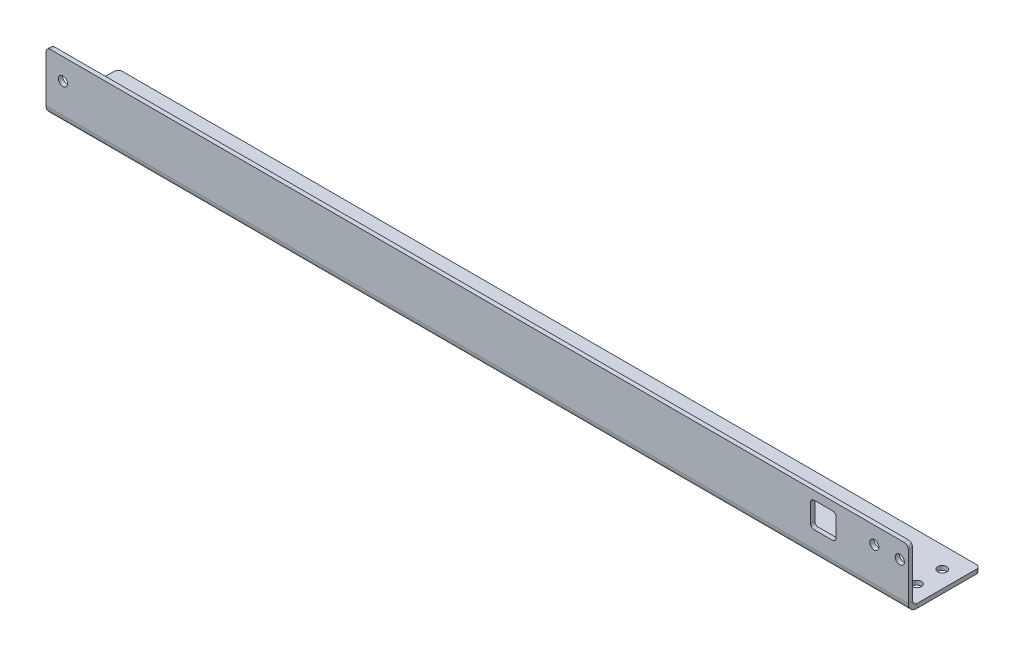
ISO-10303-21;
HEADER;
FILE_DESCRIPTION(('STEP AP214'),'2;1');
FILE_NAME('part.step','',(''),(''),'','','');
FILE_SCHEMA(('AUTOMOTIVE_DESIGN { 1 0 10303 214 1 1 1 1 }'));
ENDSEC;
DATA;
#1=APPLICATION_CONTEXT('core data for automotive mechanical design processes');
#2=APPLICATION_PROTOCOL_DEFINITION('international standard','automotive_design',2000,#1);
#3=PRODUCT_CONTEXT('',#1,'mechanical');
#4=PRODUCT('Part','Part','',(#3));
#5=PRODUCT_RELATED_PRODUCT_CATEGORY('part','',(#4));
#6=PRODUCT_DEFINITION_FORMATION('','',#4);
#7=PRODUCT_DEFINITION_CONTEXT('part definition',#1,'design');
#8=PRODUCT_DEFINITION('design','',#6,#7);
#9=PRODUCT_DEFINITION_SHAPE('','',#8);
#10=(LENGTH_UNIT() NAMED_UNIT(*) SI_UNIT(.MILLI.,.METRE.));
#11=(NAMED_UNIT(*) PLANE_ANGLE_UNIT() SI_UNIT($,.RADIAN.));
#12=(NAMED_UNIT(*) SI_UNIT($,.STERADIAN.) SOLID_ANGLE_UNIT());
#13=UNCERTAINTY_MEASURE_WITH_UNIT(LENGTH_MEASURE(1.E-05),#10,'distance_accuracy_value','');
#14=(GEOMETRIC_REPRESENTATION_CONTEXT(3) GLOBAL_UNCERTAINTY_ASSIGNED_CONTEXT((#13)) GLOBAL_UNIT_ASSIGNED_CONTEXT((#10,
#11,#12)) REPRESENTATION_CONTEXT('',''));
#15=CARTESIAN_POINT('',(0.,0.,0.));
#16=DIRECTION('',(0.,0.,1.));
#17=DIRECTION('',(1.,0.,0.));
#18=AXIS2_PLACEMENT_3D('',#15,#16,#17);
#19=CARTESIAN_POINT('',(-644.525,6.35,0.));
#20=DIRECTION('',(-1.,0.,0.));
#21=DIRECTION('',(0.,0.,-1.));
#22=AXIS2_PLACEMENT_3D('',#19,#20,#21);
#23=PLANE('',#22);
#24=DIRECTION('',(0.,0.,-1.));
#25=VECTOR('',#24,1.);
#26=CARTESIAN_POINT('',(-644.525,6.35,0.));
#27=LINE('',#26,#25);
#28=CARTESIAN_POINT('',(-644.525,6.35,0.));
#29=VERTEX_POINT('',#28);
#30=CARTESIAN_POINT('',(-644.525,6.35,-3.175));
#31=VERTEX_POINT('',#30);
#32=EDGE_CURVE('E351',#29,#31,#27,.T.);
#33=ORIENTED_EDGE('',*,*,#32,.T.);
#34=CARTESIAN_POINT('',(-644.525,6.35,-6.35));
#35=DIRECTION('',(1.,0.,0.));
#36=DIRECTION('',(0.,0.,-1.));
#37=AXIS2_PLACEMENT_3D('',#34,#35,#36);
#38=CIRCLE('',#37,3.175);
#39=CARTESIAN_POINT('',(-644.525,3.175,-6.35));
#40=VERTEX_POINT('',#39);
#41=EDGE_CURVE('E303',#40,#31,#38,.F.);
#42=ORIENTED_EDGE('',*,*,#41,.F.);
#43=DIRECTION('',(0.,-1.,0.));
#44=VECTOR('',#43,1.);
#45=CARTESIAN_POINT('',(-644.525,3.175,-6.35));
#46=LINE('',#45,#44);
#47=CARTESIAN_POINT('',(-644.525,0.,-6.35));
#48=VERTEX_POINT('',#47);
#49=EDGE_CURVE('E348',#40,#48,#46,.T.);
#50=ORIENTED_EDGE('',*,*,#49,.T.);
#51=CARTESIAN_POINT('',(-644.525,6.35,-6.35));
#52=DIRECTION('',(1.,0.,0.));
#53=DIRECTION('',(0.,0.,-1.));
#54=AXIS2_PLACEMENT_3D('',#51,#52,#53);
#55=CIRCLE('',#54,6.35);
#56=EDGE_CURVE('E295',#48,#29,#55,.F.);
#57=ORIENTED_EDGE('',*,*,#56,.T.);
#58=EDGE_LOOP('',(#33,#42,#50,#57));
#59=FACE_BOUND('',#58,.T.);
#60=ADVANCED_FACE('F36',(#59),#23,.T.);
#61=CARTESIAN_POINT('',(-644.525,3.175,-6.35));
#62=DIRECTION('',(-1.,0.,0.));
#63=DIRECTION('',(0.,0.,-1.));
#64=AXIS2_PLACEMENT_3D('',#61,#62,#63);
#65=PLANE('',#64);
#66=DIRECTION('',(0.,1.,0.));
#67=VECTOR('',#66,1.);
#68=CARTESIAN_POINT('',(-644.525,0.,-3.175));
#69=LINE('',#68,#67);
#70=CARTESIAN_POINT('',(-644.525,41.275,-3.175));
#71=VERTEX_POINT('',#70);
#72=EDGE_CURVE('E288',#31,#71,#69,.T.);
#73=ORIENTED_EDGE('',*,*,#72,.F.);
#74=ORIENTED_EDGE('',*,*,#32,.F.);
#75=DIRECTION('',(0.,1.,0.));
#76=VECTOR('',#75,1.);
#77=CARTESIAN_POINT('',(-644.525,0.,0.));
#78=LINE('',#77,#76);
#79=CARTESIAN_POINT('',(-644.525,41.275,0.));
#80=VERTEX_POINT('',#79);
#81=EDGE_CURVE('E291',#29,#80,#78,.T.);
#82=ORIENTED_EDGE('',*,*,#81,.T.);
#83=DIRECTION('',(0.,0.,-1.));
#84=VECTOR('',#83,1.);
#85=CARTESIAN_POINT('',(-644.525,41.275,-6.35));
#86=LINE('',#85,#84);
#87=EDGE_CURVE('E381',#71,#80,#86,.F.);
#88=ORIENTED_EDGE('',*,*,#87,.F.);
#89=EDGE_LOOP('',(#73,#74,#82,#88));
#90=FACE_BOUND('',#89,.T.);
#91=ADVANCED_FACE('F418',(#90),#65,.T.);
#92=CARTESIAN_POINT('',(0.,0.,-6.35));
#93=DIRECTION('',(1.,0.,0.));
#94=DIRECTION('',(0.,0.,1.));
#95=AXIS2_PLACEMENT_3D('',#92,#93,#94);
#96=PLANE('',#95);
#97=DIRECTION('',(0.,1.,0.));
#98=VECTOR('',#97,1.);
#99=CARTESIAN_POINT('',(0.,0.,-6.35));
#100=LINE('',#99,#98);
#101=CARTESIAN_POINT('',(0.,0.,-6.35));
#102=VERTEX_POINT('',#101);
#103=CARTESIAN_POINT('',(0.,3.175,-6.35));
#104=VERTEX_POINT('',#103);
#105=EDGE_CURVE('E345',#102,#104,#100,.T.);
#106=ORIENTED_EDGE('',*,*,#105,.T.);
#107=CARTESIAN_POINT('',(0.,6.35,-6.35));
#108=DIRECTION('',(1.,0.,0.));
#109=DIRECTION('',(0.,0.,-1.));
#110=AXIS2_PLACEMENT_3D('',#107,#108,#109);
#111=CIRCLE('',#110,3.175);
#112=CARTESIAN_POINT('',(0.,6.35,-3.175));
#113=VERTEX_POINT('',#112);
#114=EDGE_CURVE('E292',#104,#113,#111,.F.);
#115=ORIENTED_EDGE('',*,*,#114,.T.);
#116=DIRECTION('',(0.,0.,1.));
#117=VECTOR('',#116,1.);
#118=CARTESIAN_POINT('',(0.,6.35,-3.175));
#119=LINE('',#118,#117);
#120=CARTESIAN_POINT('',(0.,6.35,0.));
#121=VERTEX_POINT('',#120);
#122=EDGE_CURVE('E342',#113,#121,#119,.T.);
#123=ORIENTED_EDGE('',*,*,#122,.T.);
#124=CARTESIAN_POINT('',(0.,6.35,-6.35));
#125=DIRECTION('',(1.,0.,0.));
#126=DIRECTION('',(0.,0.,-1.));
#127=AXIS2_PLACEMENT_3D('',#124,#125,#126);
#128=CIRCLE('',#127,6.35);
#129=EDGE_CURVE('E311',#102,#121,#128,.F.);
#130=ORIENTED_EDGE('',*,*,#129,.F.);
#131=EDGE_LOOP('',(#106,#115,#123,#130));
#132=FACE_BOUND('',#131,.T.);
#133=ADVANCED_FACE('F409',(#132),#96,.T.);
#134=CARTESIAN_POINT('',(0.,6.35,-3.175));
#135=DIRECTION('',(1.,0.,0.));
#136=DIRECTION('',(0.,0.,1.));
#137=AXIS2_PLACEMENT_3D('',#134,#135,#136);
#138=PLANE('',#137);
#139=DIRECTION('',(0.,0.,1.));
#140=VECTOR('',#139,1.);
#141=CARTESIAN_POINT('',(0.,3.175,-53.975));
#142=LINE('',#141,#140);
#143=CARTESIAN_POINT('',(0.,3.175,-50.8));
#144=VERTEX_POINT('',#143);
#145=EDGE_CURVE('E317',#144,#104,#142,.T.);
#146=ORIENTED_EDGE('',*,*,#145,.T.);
#147=ORIENTED_EDGE('',*,*,#105,.F.);
#148=DIRECTION('',(0.,0.,1.));
#149=VECTOR('',#148,1.);
#150=CARTESIAN_POINT('',(0.,0.,-53.975));
#151=LINE('',#150,#149);
#152=CARTESIAN_POINT('',(0.,0.,-50.8));
#153=VERTEX_POINT('',#152);
#154=EDGE_CURVE('E314',#153,#102,#151,.T.);
#155=ORIENTED_EDGE('',*,*,#154,.F.);
#156=DIRECTION('',(0.,-1.,0.));
#157=VECTOR('',#156,1.);
#158=CARTESIAN_POINT('',(0.,6.35,-50.8));
#159=LINE('',#158,#157);
#160=EDGE_CURVE('E11',#144,#153,#159,.T.);
#161=ORIENTED_EDGE('',*,*,#160,.F.);
#162=EDGE_LOOP('',(#146,#147,#155,#161));
#163=FACE_BOUND('',#162,.T.);
#164=ADVANCED_FACE('F441',(#163),#138,.T.);
#165=CARTESIAN_POINT('',(-644.525,0.,-3.175));
#166=DIRECTION('',(0.,0.,1.));
#167=DIRECTION('',(-1.,0.,0.));
#168=AXIS2_PLACEMENT_3D('',#165,#166,#167);
#169=PLANE('',#168);
#170=CARTESIAN_POINT('',(-631.825,28.575,-3.175));
#171=DIRECTION('',(0.,0.,-1.));
#172=DIRECTION('',(-1.,0.,0.));
#173=AXIS2_PLACEMENT_3D('',#170,#171,#172);
#174=CIRCLE('',#173,3.429);
#175=CARTESIAN_POINT('',(-635.254,28.575,-3.175));
#176=VERTEX_POINT('',#175);
#177=EDGE_CURVE('E246',#176,#176,#174,.T.);
#178=ORIENTED_EDGE('',*,*,#177,.F.);
#179=EDGE_LOOP('',(#178));
#180=FACE_BOUND('',#179,.T.);
#181=CARTESIAN_POINT('',(-25.4,31.75,-3.175));
#182=DIRECTION('',(0.,0.,-1.));
#183=DIRECTION('',(-1.,0.,0.));
#184=AXIS2_PLACEMENT_3D('',#181,#182,#183);
#185=CIRCLE('',#184,3.42899999999999);
#186=CARTESIAN_POINT('',(-28.829,31.75,-3.175));
#187=VERTEX_POINT('',#186);
#188=EDGE_CURVE('E254',#187,#187,#185,.T.);
#189=ORIENTED_EDGE('',*,*,#188,.F.);
#190=EDGE_LOOP('',(#189));
#191=FACE_BOUND('',#190,.T.);
#192=CARTESIAN_POINT('',(-6.35,31.75,-3.175));
#193=DIRECTION('',(0.,0.,-1.));
#194=DIRECTION('',(-1.,0.,0.));
#195=AXIS2_PLACEMENT_3D('',#192,#193,#194);
#196=CIRCLE('',#195,3.429);
#197=CARTESIAN_POINT('',(-9.779,31.75,-3.175));
#198=VERTEX_POINT('',#197);
#199=EDGE_CURVE('E253',#198,#198,#196,.T.);
#200=ORIENTED_EDGE('',*,*,#199,.F.);
#201=EDGE_LOOP('',(#200));
#202=FACE_BOUND('',#201,.T.);
#203=DIRECTION('',(-1.,0.,0.));
#204=VECTOR('',#203,1.);
#205=CARTESIAN_POINT('',(-70.485,38.1,-3.175));
#206=LINE('',#205,#204);
#207=CARTESIAN_POINT('',(-56.515,38.1,-3.175));
#208=VERTEX_POINT('',#207);
#209=CARTESIAN_POINT('',(-70.485,38.1,-3.175));
#210=VERTEX_POINT('',#209);
#211=EDGE_CURVE('E209',#208,#210,#206,.T.);
#212=ORIENTED_EDGE('',*,*,#211,.T.);
#213=CARTESIAN_POINT('',(-70.485,35.56,-3.175));
#214=DIRECTION('',(0.,0.,1.));
#215=DIRECTION('',(-1.,0.,0.));
#216=AXIS2_PLACEMENT_3D('',#213,#214,#215);
#217=CIRCLE('',#216,2.54);
#218=CARTESIAN_POINT('',(-73.025,35.56,-3.175));
#219=VERTEX_POINT('',#218);
#220=EDGE_CURVE('E211',#210,#219,#217,.T.);
#221=ORIENTED_EDGE('',*,*,#220,.T.);
#222=DIRECTION('',(0.,-1.,0.));
#223=VECTOR('',#222,1.);
#224=CARTESIAN_POINT('',(-73.025,35.56,-3.175));
#225=LINE('',#224,#223);
#226=CARTESIAN_POINT('',(-73.025,21.59,-3.175));
#227=VERTEX_POINT('',#226);
#228=EDGE_CURVE('E191',#219,#227,#225,.T.);
#229=ORIENTED_EDGE('',*,*,#228,.T.);
#230=CARTESIAN_POINT('',(-70.485,21.59,-3.175));
#231=DIRECTION('',(0.,0.,1.));
#232=DIRECTION('',(-1.,0.,0.));
#233=AXIS2_PLACEMENT_3D('',#230,#231,#232);
#234=CIRCLE('',#233,2.54);
#235=CARTESIAN_POINT('',(-70.485,19.05,-3.175));
#236=VERTEX_POINT('',#235);
#237=EDGE_CURVE('E181',#227,#236,#234,.T.);
#238=ORIENTED_EDGE('',*,*,#237,.T.);
#239=DIRECTION('',(1.,0.,0.));
#240=VECTOR('',#239,1.);
#241=CARTESIAN_POINT('',(-70.485,19.05,-3.175));
#242=LINE('',#241,#240);
#243=CARTESIAN_POINT('',(-56.5150000000001,19.05,-3.175));
#244=VERTEX_POINT('',#243);
#245=EDGE_CURVE('E173',#236,#244,#242,.T.);
#246=ORIENTED_EDGE('',*,*,#245,.T.);
#247=CARTESIAN_POINT('',(-56.515,21.59,-3.175));
#248=DIRECTION('',(0.,0.,1.));
#249=DIRECTION('',(1.,0.,0.));
#250=AXIS2_PLACEMENT_3D('',#247,#248,#249);
#251=CIRCLE('',#250,2.54);
#252=CARTESIAN_POINT('',(-53.975,21.59,-3.175));
#253=VERTEX_POINT('',#252);
#254=EDGE_CURVE('E51',#244,#253,#251,.T.);
#255=ORIENTED_EDGE('',*,*,#254,.T.);
#256=DIRECTION('',(0.,1.,0.));
#257=VECTOR('',#256,1.);
#258=CARTESIAN_POINT('',(-53.975,35.56,-3.175));
#259=LINE('',#258,#257);
#260=CARTESIAN_POINT('',(-53.975,35.56,-3.175));
#261=VERTEX_POINT('',#260);
#262=EDGE_CURVE('E203',#253,#261,#259,.T.);
#263=ORIENTED_EDGE('',*,*,#262,.T.);
#264=CARTESIAN_POINT('',(-56.515,35.56,-3.175));
#265=DIRECTION('',(0.,0.,1.));
#266=DIRECTION('',(-1.,0.,0.));
#267=AXIS2_PLACEMENT_3D('',#264,#265,#266);
#268=CIRCLE('',#267,2.54);
#269=EDGE_CURVE('E206',#261,#208,#268,.T.);
#270=ORIENTED_EDGE('',*,*,#269,.T.);
#271=EDGE_LOOP('',(#212,#221,#229,#238,#246,#255,#263,#270));
#272=FACE_BOUND('',#271,.T.);
#273=DIRECTION('',(1.,0.,0.));
#274=VECTOR('',#273,1.);
#275=CARTESIAN_POINT('',(-644.525,44.45,-3.175));
#276=LINE('',#275,#274);
#277=CARTESIAN_POINT('',(-641.35,44.45,-3.175));
#278=VERTEX_POINT('',#277);
#279=CARTESIAN_POINT('',(-3.17500000000004,44.45,-3.175));
#280=VERTEX_POINT('',#279);
#281=EDGE_CURVE('E339',#278,#280,#276,.T.);
#282=ORIENTED_EDGE('',*,*,#281,.T.);
#283=CARTESIAN_POINT('',(-3.175,41.275,-3.175));
#284=DIRECTION('',(0.,0.,-1.));
#285=DIRECTION('',(-1.,0.,0.));
#286=AXIS2_PLACEMENT_3D('',#283,#284,#285);
#287=CIRCLE('',#286,3.175);
#288=CARTESIAN_POINT('',(0.,41.275,-3.175));
#289=VERTEX_POINT('',#288);
#290=EDGE_CURVE('E376',#289,#280,#287,.F.);
#291=ORIENTED_EDGE('',*,*,#290,.F.);
#292=DIRECTION('',(0.,1.,0.));
#293=VECTOR('',#292,1.);
#294=CARTESIAN_POINT('',(0.,0.,-3.175));
#295=LINE('',#294,#293);
#296=EDGE_CURVE('E285',#113,#289,#295,.T.);
#297=ORIENTED_EDGE('',*,*,#296,.F.);
#298=DIRECTION('',(1.,0.,0.));
#299=VECTOR('',#298,1.);
#300=CARTESIAN_POINT('',(-644.525,6.35,-3.175));
#301=LINE('',#300,#299);
#302=EDGE_CURVE('E306',#31,#113,#301,.T.);
#303=ORIENTED_EDGE('',*,*,#302,.F.);
#304=ORIENTED_EDGE('',*,*,#72,.T.);
#305=CARTESIAN_POINT('',(-641.35,41.275,-3.175));
#306=DIRECTION('',(0.,0.,-1.));
#307=DIRECTION('',(-1.,0.,0.));
#308=AXIS2_PLACEMENT_3D('',#305,#306,#307);
#309=CIRCLE('',#308,3.175);
#310=EDGE_CURVE('E379',#278,#71,#309,.F.);
#311=ORIENTED_EDGE('',*,*,#310,.F.);
#312=EDGE_LOOP('',(#282,#291,#297,#303,#304,#311));
#313=FACE_BOUND('',#312,.T.);
#314=ADVANCED_FACE('F194',(#180,#191,#202,#272,#313),#169,.F.);
#315=CARTESIAN_POINT('',(-644.525,44.45,0.));
#316=DIRECTION('',(0.,1.,0.));
#317=DIRECTION('',(0.,0.,1.));
#318=AXIS2_PLACEMENT_3D('',#315,#316,#317);
#319=PLANE('',#318);
#320=DIRECTION('',(1.,0.,0.));
#321=VECTOR('',#320,1.);
#322=CARTESIAN_POINT('',(-644.525,44.45,0.));
#323=LINE('',#322,#321);
#324=CARTESIAN_POINT('',(-641.35,44.45,0.));
#325=VERTEX_POINT('',#324);
#326=CARTESIAN_POINT('',(-3.17500000000004,44.45,0.));
#327=VERTEX_POINT('',#326);
#328=EDGE_CURVE('E336',#325,#327,#323,.T.);
#329=ORIENTED_EDGE('',*,*,#328,.T.);
#330=DIRECTION('',(0.,0.,-1.));
#331=VECTOR('',#330,1.);
#332=CARTESIAN_POINT('',(-3.175,44.45,0.));
#333=LINE('',#332,#331);
#334=EDGE_CURVE('E371',#280,#327,#333,.F.);
#335=ORIENTED_EDGE('',*,*,#334,.F.);
#336=ORIENTED_EDGE('',*,*,#281,.F.);
#337=DIRECTION('',(0.,0.,-1.));
#338=VECTOR('',#337,1.);
#339=CARTESIAN_POINT('',(-641.35,44.45,0.));
#340=LINE('',#339,#338);
#341=EDGE_CURVE('E374',#325,#278,#340,.T.);
#342=ORIENTED_EDGE('',*,*,#341,.F.);
#343=EDGE_LOOP('',(#329,#335,#336,#342));
#344=FACE_BOUND('',#343,.T.);
#345=ADVANCED_FACE('F397',(#344),#319,.T.);
#346=CARTESIAN_POINT('',(-644.525,0.,0.));
#347=DIRECTION('',(0.,0.,1.));
#348=DIRECTION('',(-1.,0.,0.));
#349=AXIS2_PLACEMENT_3D('',#346,#347,#348);
#350=PLANE('',#349);
#351=CARTESIAN_POINT('',(-70.485,35.56,0.));
#352=DIRECTION('',(0.,0.,1.));
#353=DIRECTION('',(-1.,0.,0.));
#354=AXIS2_PLACEMENT_3D('',#351,#352,#353);
#355=CIRCLE('',#354,2.54);
#356=CARTESIAN_POINT('',(-70.485,38.1,0.));
#357=VERTEX_POINT('',#356);
#358=CARTESIAN_POINT('',(-73.025,35.56,0.));
#359=VERTEX_POINT('',#358);
#360=EDGE_CURVE('E199',#357,#359,#355,.T.);
#361=ORIENTED_EDGE('',*,*,#360,.F.);
#362=DIRECTION('',(-1.,0.,0.));
#363=VECTOR('',#362,1.);
#364=CARTESIAN_POINT('',(-70.485,38.1,0.));
#365=LINE('',#364,#363);
#366=CARTESIAN_POINT('',(-56.515,38.1,0.));
#367=VERTEX_POINT('',#366);
#368=EDGE_CURVE('E225',#367,#357,#365,.T.);
#369=ORIENTED_EDGE('',*,*,#368,.F.);
#370=CARTESIAN_POINT('',(-56.515,35.56,0.));
#371=DIRECTION('',(0.,0.,1.));
#372=DIRECTION('',(-1.,0.,0.));
#373=AXIS2_PLACEMENT_3D('',#370,#371,#372);
#374=CIRCLE('',#373,2.54);
#375=CARTESIAN_POINT('',(-53.975,35.56,0.));
#376=VERTEX_POINT('',#375);
#377=EDGE_CURVE('E222',#376,#367,#374,.T.);
#378=ORIENTED_EDGE('',*,*,#377,.F.);
#379=DIRECTION('',(0.,1.,0.));
#380=VECTOR('',#379,1.);
#381=CARTESIAN_POINT('',(-53.975,35.56,0.));
#382=LINE('',#381,#380);
#383=CARTESIAN_POINT('',(-53.975,21.59,0.));
#384=VERTEX_POINT('',#383);
#385=EDGE_CURVE('E220',#384,#376,#382,.T.);
#386=ORIENTED_EDGE('',*,*,#385,.F.);
#387=CARTESIAN_POINT('',(-56.515,21.59,0.));
#388=DIRECTION('',(0.,0.,1.));
#389=DIRECTION('',(1.,0.,0.));
#390=AXIS2_PLACEMENT_3D('',#387,#388,#389);
#391=CIRCLE('',#390,2.54);
#392=CARTESIAN_POINT('',(-56.515,19.05,0.));
#393=VERTEX_POINT('',#392);
#394=EDGE_CURVE('E217',#393,#384,#391,.T.);
#395=ORIENTED_EDGE('',*,*,#394,.F.);
#396=DIRECTION('',(1.,0.,0.));
#397=VECTOR('',#396,1.);
#398=CARTESIAN_POINT('',(-70.485,19.05,0.));
#399=LINE('',#398,#397);
#400=CARTESIAN_POINT('',(-70.485,19.05,0.));
#401=VERTEX_POINT('',#400);
#402=EDGE_CURVE('E215',#401,#393,#399,.T.);
#403=ORIENTED_EDGE('',*,*,#402,.F.);
#404=CARTESIAN_POINT('',(-70.485,21.59,0.));
#405=DIRECTION('',(0.,0.,1.));
#406=DIRECTION('',(-1.,0.,0.));
#407=AXIS2_PLACEMENT_3D('',#404,#405,#406);
#408=CIRCLE('',#407,2.54);
#409=CARTESIAN_POINT('',(-73.025,21.59,0.));
#410=VERTEX_POINT('',#409);
#411=EDGE_CURVE('E189',#410,#401,#408,.T.);
#412=ORIENTED_EDGE('',*,*,#411,.F.);
#413=DIRECTION('',(0.,-1.,0.));
#414=VECTOR('',#413,1.);
#415=CARTESIAN_POINT('',(-73.025,35.56,0.));
#416=LINE('',#415,#414);
#417=EDGE_CURVE('E197',#359,#410,#416,.T.);
#418=ORIENTED_EDGE('',*,*,#417,.F.);
#419=EDGE_LOOP('',(#361,#369,#378,#386,#395,#403,#412,#418));
#420=FACE_BOUND('',#419,.T.);
#421=CARTESIAN_POINT('',(-631.825,28.575,0.));
#422=DIRECTION('',(0.,0.,-1.));
#423=DIRECTION('',(-1.,0.,0.));
#424=AXIS2_PLACEMENT_3D('',#421,#422,#423);
#425=CIRCLE('',#424,3.429);
#426=CARTESIAN_POINT('',(-635.254,28.575,0.));
#427=VERTEX_POINT('',#426);
#428=EDGE_CURVE('E250',#427,#427,#425,.T.);
#429=ORIENTED_EDGE('',*,*,#428,.T.);
#430=EDGE_LOOP('',(#429));
#431=FACE_BOUND('',#430,.T.);
#432=CARTESIAN_POINT('',(-25.4,31.75,0.));
#433=DIRECTION('',(0.,0.,-1.));
#434=DIRECTION('',(-1.,0.,0.));
#435=AXIS2_PLACEMENT_3D('',#432,#433,#434);
#436=CIRCLE('',#435,3.42899999999999);
#437=CARTESIAN_POINT('',(-28.829,31.75,0.));
#438=VERTEX_POINT('',#437);
#439=EDGE_CURVE('E231',#438,#438,#436,.T.);
#440=ORIENTED_EDGE('',*,*,#439,.T.);
#441=EDGE_LOOP('',(#440));
#442=FACE_BOUND('',#441,.T.);
#443=CARTESIAN_POINT('',(-6.35,31.75,0.));
#444=DIRECTION('',(0.,0.,-1.));
#445=DIRECTION('',(-1.,0.,0.));
#446=AXIS2_PLACEMENT_3D('',#443,#444,#445);
#447=CIRCLE('',#446,3.429);
#448=CARTESIAN_POINT('',(-9.779,31.75,0.));
#449=VERTEX_POINT('',#448);
#450=EDGE_CURVE('E257',#449,#449,#447,.T.);
#451=ORIENTED_EDGE('',*,*,#450,.T.);
#452=EDGE_LOOP('',(#451));
#453=FACE_BOUND('',#452,.T.);
#454=ORIENTED_EDGE('',*,*,#81,.F.);
#455=DIRECTION('',(1.,0.,0.));
#456=VECTOR('',#455,1.);
#457=CARTESIAN_POINT('',(-644.525,6.35,0.));
#458=LINE('',#457,#456);
#459=EDGE_CURVE('E333',#29,#121,#458,.T.);
#460=ORIENTED_EDGE('',*,*,#459,.T.);
#461=DIRECTION('',(0.,1.,0.));
#462=VECTOR('',#461,1.);
#463=CARTESIAN_POINT('',(0.,0.,0.));
#464=LINE('',#463,#462);
#465=CARTESIAN_POINT('',(0.,41.275,0.));
#466=VERTEX_POINT('',#465);
#467=EDGE_CURVE('E308',#121,#466,#464,.T.);
#468=ORIENTED_EDGE('',*,*,#467,.T.);
#469=CARTESIAN_POINT('',(-3.175,41.275,0.));
#470=DIRECTION('',(0.,0.,-1.));
#471=DIRECTION('',(-1.,0.,0.));
#472=AXIS2_PLACEMENT_3D('',#469,#470,#471);
#473=CIRCLE('',#472,3.175);
#474=EDGE_CURVE('E384',#327,#466,#473,.T.);
#475=ORIENTED_EDGE('',*,*,#474,.F.);
#476=ORIENTED_EDGE('',*,*,#328,.F.);
#477=CARTESIAN_POINT('',(-641.35,41.275,0.));
#478=DIRECTION('',(0.,0.,-1.));
#479=DIRECTION('',(-1.,0.,0.));
#480=AXIS2_PLACEMENT_3D('',#477,#478,#479);
#481=CIRCLE('',#480,3.175);
#482=EDGE_CURVE('E386',#80,#325,#481,.T.);
#483=ORIENTED_EDGE('',*,*,#482,.F.);
#484=EDGE_LOOP('',(#454,#460,#468,#475,#476,#483));
#485=FACE_BOUND('',#484,.T.);
#486=ADVANCED_FACE('F401',(#420,#431,#442,#453,#485),#350,.T.);
#487=CARTESIAN_POINT('',(-644.525,6.35,-6.35));
#488=DIRECTION('',(1.,0.,0.));
#489=DIRECTION('',(0.,0.,1.));
#490=AXIS2_PLACEMENT_3D('',#487,#488,#489);
#491=CYLINDRICAL_SURFACE('',#490,6.35);
#492=ORIENTED_EDGE('',*,*,#129,.T.);
#493=ORIENTED_EDGE('',*,*,#459,.F.);
#494=ORIENTED_EDGE('',*,*,#56,.F.);
#495=DIRECTION('',(1.,0.,0.));
#496=VECTOR('',#495,1.);
#497=CARTESIAN_POINT('',(-644.525,0.,-6.35));
#498=LINE('',#497,#496);
#499=EDGE_CURVE('E331',#48,#102,#498,.T.);
#500=ORIENTED_EDGE('',*,*,#499,.T.);
#501=EDGE_LOOP('',(#492,#493,#494,#500));
#502=FACE_BOUND('',#501,.T.);
#503=ADVANCED_FACE('F405',(#502),#491,.T.);
#504=CARTESIAN_POINT('',(-644.525,0.,-53.975));
#505=DIRECTION('',(0.,-1.,0.));
#506=DIRECTION('',(0.,0.,-1.));
#507=AXIS2_PLACEMENT_3D('',#504,#505,#506);
#508=PLANE('',#507);
#509=CARTESIAN_POINT('',(-12.7,0.,-19.05));
#510=DIRECTION('',(0.,1.,0.));
#511=DIRECTION('',(0.,0.,-1.));
#512=AXIS2_PLACEMENT_3D('',#509,#510,#511);
#513=CIRCLE('',#512,3.429);
#514=CARTESIAN_POINT('',(-12.7,0.,-22.479));
#515=VERTEX_POINT('',#514);
#516=EDGE_CURVE('E249',#515,#515,#513,.T.);
#517=ORIENTED_EDGE('',*,*,#516,.T.);
#518=EDGE_LOOP('',(#517));
#519=FACE_BOUND('',#518,.T.);
#520=CARTESIAN_POINT('',(-12.7,0.,-38.1));
#521=DIRECTION('',(0.,1.,0.));
#522=DIRECTION('',(0.,0.,-1.));
#523=AXIS2_PLACEMENT_3D('',#520,#521,#522);
#524=CIRCLE('',#523,3.429);
#525=CARTESIAN_POINT('',(-12.7,0.,-41.529));
#526=VERTEX_POINT('',#525);
#527=EDGE_CURVE('E274',#526,#526,#524,.T.);
#528=ORIENTED_EDGE('',*,*,#527,.T.);
#529=EDGE_LOOP('',(#528));
#530=FACE_BOUND('',#529,.T.);
#531=CARTESIAN_POINT('',(-631.825,0.,-38.1));
#532=DIRECTION('',(0.,1.,0.));
#533=DIRECTION('',(0.,0.,-1.));
#534=AXIS2_PLACEMENT_3D('',#531,#532,#533);
#535=CIRCLE('',#534,3.429);
#536=CARTESIAN_POINT('',(-631.825,0.,-41.529));
#537=VERTEX_POINT('',#536);
#538=EDGE_CURVE('E268',#537,#537,#535,.T.);
#539=ORIENTED_EDGE('',*,*,#538,.T.);
#540=EDGE_LOOP('',(#539));
#541=FACE_BOUND('',#540,.T.);
#542=CARTESIAN_POINT('',(-631.825,0.,-19.05));
#543=DIRECTION('',(0.,1.,0.));
#544=DIRECTION('',(0.,0.,-1.));
#545=AXIS2_PLACEMENT_3D('',#542,#543,#544);
#546=CIRCLE('',#545,3.429);
#547=CARTESIAN_POINT('',(-631.825,0.,-22.479));
#548=VERTEX_POINT('',#547);
#549=EDGE_CURVE('E267',#548,#548,#546,.T.);
#550=ORIENTED_EDGE('',*,*,#549,.T.);
#551=EDGE_LOOP('',(#550));
#552=FACE_BOUND('',#551,.T.);
#553=DIRECTION('',(1.,0.,0.));
#554=VECTOR('',#553,1.);
#555=CARTESIAN_POINT('',(-644.525,0.,-53.975));
#556=LINE('',#555,#554);
#557=CARTESIAN_POINT('',(-641.35,0.,-53.975));
#558=VERTEX_POINT('',#557);
#559=CARTESIAN_POINT('',(-3.17500000000004,0.,-53.975));
#560=VERTEX_POINT('',#559);
#561=EDGE_CURVE('E328',#558,#560,#556,.T.);
#562=ORIENTED_EDGE('',*,*,#561,.T.);
#563=CARTESIAN_POINT('',(-3.175,0.,-50.8));
#564=DIRECTION('',(0.,1.,0.));
#565=DIRECTION('',(0.,0.,-1.));
#566=AXIS2_PLACEMENT_3D('',#563,#564,#565);
#567=CIRCLE('',#566,3.175);
#568=EDGE_CURVE('E359',#153,#560,#567,.T.);
#569=ORIENTED_EDGE('',*,*,#568,.F.);
#570=ORIENTED_EDGE('',*,*,#154,.T.);
#571=ORIENTED_EDGE('',*,*,#499,.F.);
#572=DIRECTION('',(0.,0.,1.));
#573=VECTOR('',#572,1.);
#574=CARTESIAN_POINT('',(-644.525,0.,-53.975));
#575=LINE('',#574,#573);
#576=CARTESIAN_POINT('',(-644.525,0.,-50.8));
#577=VERTEX_POINT('',#576);
#578=EDGE_CURVE('E298',#577,#48,#575,.T.);
#579=ORIENTED_EDGE('',*,*,#578,.F.);
#580=CARTESIAN_POINT('',(-641.35,0.,-50.8));
#581=DIRECTION('',(0.,1.,0.));
#582=DIRECTION('',(0.,0.,-1.));
#583=AXIS2_PLACEMENT_3D('',#580,#581,#582);
#584=CIRCLE('',#583,3.175);
#585=EDGE_CURVE('E362',#558,#577,#584,.T.);
#586=ORIENTED_EDGE('',*,*,#585,.F.);
#587=EDGE_LOOP('',(#562,#569,#570,#571,#579,#586));
#588=FACE_BOUND('',#587,.T.);
#589=ADVANCED_FACE('F455',(#519,#530,#541,#552,#588),#508,.T.);
#590=CARTESIAN_POINT('',(-644.525,3.175,-53.975));
#591=DIRECTION('',(0.,0.,-1.));
#592=DIRECTION('',(1.,0.,0.));
#593=AXIS2_PLACEMENT_3D('',#590,#591,#592);
#594=PLANE('',#593);
#595=DIRECTION('',(1.,0.,0.));
#596=VECTOR('',#595,1.);
#597=CARTESIAN_POINT('',(-644.525,3.175,-53.975));
#598=LINE('',#597,#596);
#599=CARTESIAN_POINT('',(-641.35,3.175,-53.975));
#600=VERTEX_POINT('',#599);
#601=CARTESIAN_POINT('',(-3.17500000000004,3.175,-53.975));
#602=VERTEX_POINT('',#601);
#603=EDGE_CURVE('E325',#600,#602,#598,.T.);
#604=ORIENTED_EDGE('',*,*,#603,.T.);
#605=DIRECTION('',(0.,-1.,0.));
#606=VECTOR('',#605,1.);
#607=CARTESIAN_POINT('',(-3.17500000000004,3.175,-53.975));
#608=LINE('',#607,#606);
#609=EDGE_CURVE('E354',#560,#602,#608,.F.);
#610=ORIENTED_EDGE('',*,*,#609,.F.);
#611=ORIENTED_EDGE('',*,*,#561,.F.);
#612=DIRECTION('',(0.,-1.,0.));
#613=VECTOR('',#612,1.);
#614=CARTESIAN_POINT('',(-641.35,3.175,-53.975));
#615=LINE('',#614,#613);
#616=EDGE_CURVE('E357',#600,#558,#615,.T.);
#617=ORIENTED_EDGE('',*,*,#616,.F.);
#618=EDGE_LOOP('',(#604,#610,#611,#617));
#619=FACE_BOUND('',#618,.T.);
#620=ADVANCED_FACE('F458',(#619),#594,.T.);
#621=CARTESIAN_POINT('',(-644.525,3.175,-53.975));
#622=DIRECTION('',(0.,-1.,0.));
#623=DIRECTION('',(0.,0.,-1.));
#624=AXIS2_PLACEMENT_3D('',#621,#622,#623);
#625=PLANE('',#624);
#626=CARTESIAN_POINT('',(-12.7,3.175,-19.05));
#627=DIRECTION('',(0.,1.,0.));
#628=DIRECTION('',(0.,0.,-1.));
#629=AXIS2_PLACEMENT_3D('',#626,#627,#628);
#630=CIRCLE('',#629,3.429);
#631=CARTESIAN_POINT('',(-12.7,3.175,-22.479));
#632=VERTEX_POINT('',#631);
#633=EDGE_CURVE('E277',#632,#632,#630,.T.);
#634=ORIENTED_EDGE('',*,*,#633,.F.);
#635=EDGE_LOOP('',(#634));
#636=FACE_BOUND('',#635,.T.);
#637=CARTESIAN_POINT('',(-12.7,3.175,-38.1));
#638=DIRECTION('',(0.,1.,0.));
#639=DIRECTION('',(0.,0.,-1.));
#640=AXIS2_PLACEMENT_3D('',#637,#638,#639);
#641=CIRCLE('',#640,3.429);
#642=CARTESIAN_POINT('',(-12.7,3.175,-41.529));
#643=VERTEX_POINT('',#642);
#644=EDGE_CURVE('E271',#643,#643,#641,.T.);
#645=ORIENTED_EDGE('',*,*,#644,.F.);
#646=EDGE_LOOP('',(#645));
#647=FACE_BOUND('',#646,.T.);
#648=CARTESIAN_POINT('',(-631.825,3.175,-38.1));
#649=DIRECTION('',(0.,1.,0.));
#650=DIRECTION('',(0.,0.,-1.));
#651=AXIS2_PLACEMENT_3D('',#648,#649,#650);
#652=CIRCLE('',#651,3.429);
#653=CARTESIAN_POINT('',(-631.825,3.175,-41.529));
#654=VERTEX_POINT('',#653);
#655=EDGE_CURVE('E264',#654,#654,#652,.T.);
#656=ORIENTED_EDGE('',*,*,#655,.F.);
#657=EDGE_LOOP('',(#656));
#658=FACE_BOUND('',#657,.T.);
#659=CARTESIAN_POINT('',(-631.825,3.175,-19.05));
#660=DIRECTION('',(0.,1.,0.));
#661=DIRECTION('',(0.,0.,-1.));
#662=AXIS2_PLACEMENT_3D('',#659,#660,#661);
#663=CIRCLE('',#662,3.429);
#664=CARTESIAN_POINT('',(-631.825,3.175,-22.479));
#665=VERTEX_POINT('',#664);
#666=EDGE_CURVE('E282',#665,#665,#663,.T.);
#667=ORIENTED_EDGE('',*,*,#666,.F.);
#668=EDGE_LOOP('',(#667));
#669=FACE_BOUND('',#668,.T.);
#670=DIRECTION('',(0.,0.,1.));
#671=VECTOR('',#670,1.);
#672=CARTESIAN_POINT('',(-644.525,3.175,-53.975));
#673=LINE('',#672,#671);
#674=CARTESIAN_POINT('',(-644.525,3.175,-50.8));
#675=VERTEX_POINT('',#674);
#676=EDGE_CURVE('E300',#675,#40,#673,.T.);
#677=ORIENTED_EDGE('',*,*,#676,.T.);
#678=DIRECTION('',(1.,0.,0.));
#679=VECTOR('',#678,1.);
#680=CARTESIAN_POINT('',(-644.525,3.175,-6.35));
#681=LINE('',#680,#679);
#682=EDGE_CURVE('E323',#40,#104,#681,.T.);
#683=ORIENTED_EDGE('',*,*,#682,.T.);
#684=ORIENTED_EDGE('',*,*,#145,.F.);
#685=CARTESIAN_POINT('',(-3.175,3.175,-50.8));
#686=DIRECTION('',(0.,1.,0.));
#687=DIRECTION('',(0.,0.,-1.));
#688=AXIS2_PLACEMENT_3D('',#685,#686,#687);
#689=CIRCLE('',#688,3.175);
#690=EDGE_CURVE('E367',#602,#144,#689,.F.);
#691=ORIENTED_EDGE('',*,*,#690,.F.);
#692=ORIENTED_EDGE('',*,*,#603,.F.);
#693=CARTESIAN_POINT('',(-641.35,3.175,-50.8));
#694=DIRECTION('',(0.,1.,0.));
#695=DIRECTION('',(0.,0.,-1.));
#696=AXIS2_PLACEMENT_3D('',#693,#694,#695);
#697=CIRCLE('',#696,3.175);
#698=EDGE_CURVE('E369',#675,#600,#697,.F.);
#699=ORIENTED_EDGE('',*,*,#698,.F.);
#700=EDGE_LOOP('',(#677,#683,#684,#691,#692,#699));
#701=FACE_BOUND('',#700,.T.);
#702=ADVANCED_FACE('F462',(#636,#647,#658,#669,#701),#625,.F.);
#703=CARTESIAN_POINT('',(-644.525,6.35,-6.35));
#704=DIRECTION('',(1.,0.,0.));
#705=DIRECTION('',(0.,0.,1.));
#706=AXIS2_PLACEMENT_3D('',#703,#704,#705);
#707=CYLINDRICAL_SURFACE('',#706,3.175);
#708=ORIENTED_EDGE('',*,*,#114,.F.);
#709=ORIENTED_EDGE('',*,*,#682,.F.);
#710=ORIENTED_EDGE('',*,*,#41,.T.);
#711=ORIENTED_EDGE('',*,*,#302,.T.);
#712=EDGE_LOOP('',(#708,#709,#710,#711));
#713=FACE_BOUND('',#712,.T.);
#714=ADVANCED_FACE('F412',(#713),#707,.F.);
#715=CARTESIAN_POINT('',(-644.525,6.35,-6.35));
#716=DIRECTION('',(-1.,0.,0.));
#717=DIRECTION('',(0.,0.,-1.));
#718=AXIS2_PLACEMENT_3D('',#715,#716,#717);
#719=PLANE('',#718);
#720=ORIENTED_EDGE('',*,*,#578,.T.);
#721=ORIENTED_EDGE('',*,*,#49,.F.);
#722=ORIENTED_EDGE('',*,*,#676,.F.);
#723=DIRECTION('',(0.,-1.,0.));
#724=VECTOR('',#723,1.);
#725=CARTESIAN_POINT('',(-644.525,6.35,-50.8));
#726=LINE('',#725,#724);
#727=EDGE_CURVE('E365',#577,#675,#726,.F.);
#728=ORIENTED_EDGE('',*,*,#727,.F.);
#729=EDGE_LOOP('',(#720,#721,#722,#728));
#730=FACE_BOUND('',#729,.T.);
#731=ADVANCED_FACE('F469',(#730),#719,.T.);
#732=CARTESIAN_POINT('',(0.,6.35,-6.35));
#733=DIRECTION('',(-1.,0.,0.));
#734=DIRECTION('',(0.,0.,-1.));
#735=AXIS2_PLACEMENT_3D('',#732,#733,#734);
#736=PLANE('',#735);
#737=ORIENTED_EDGE('',*,*,#467,.F.);
#738=ORIENTED_EDGE('',*,*,#122,.F.);
#739=ORIENTED_EDGE('',*,*,#296,.T.);
#740=DIRECTION('',(0.,0.,-1.));
#741=VECTOR('',#740,1.);
#742=CARTESIAN_POINT('',(0.,41.275,-3.175));
#743=LINE('',#742,#741);
#744=EDGE_CURVE('E44',#466,#289,#743,.T.);
#745=ORIENTED_EDGE('',*,*,#744,.F.);
#746=EDGE_LOOP('',(#737,#738,#739,#745));
#747=FACE_BOUND('',#746,.T.);
#748=ADVANCED_FACE('F392',(#747),#736,.F.);
#749=CARTESIAN_POINT('',(-631.825,3.175,-19.05));
#750=DIRECTION('',(0.,-1.,0.));
#751=DIRECTION('',(0.,0.,-1.));
#752=AXIS2_PLACEMENT_3D('',#749,#750,#751);
#753=CYLINDRICAL_SURFACE('',#752,3.429);
#754=ORIENTED_EDGE('',*,*,#666,.T.);
#755=EDGE_LOOP('',(#754));
#756=FACE_BOUND('',#755,.T.);
#757=ORIENTED_EDGE('',*,*,#549,.F.);
#758=EDGE_LOOP('',(#757));
#759=FACE_BOUND('',#758,.T.);
#760=ADVANCED_FACE('F472',(#756,#759),#753,.F.);
#761=CARTESIAN_POINT('',(-631.825,3.175,-38.1));
#762=DIRECTION('',(0.,-1.,0.));
#763=DIRECTION('',(0.,0.,-1.));
#764=AXIS2_PLACEMENT_3D('',#761,#762,#763);
#765=CYLINDRICAL_SURFACE('',#764,3.429);
#766=ORIENTED_EDGE('',*,*,#655,.T.);
#767=EDGE_LOOP('',(#766));
#768=FACE_BOUND('',#767,.T.);
#769=ORIENTED_EDGE('',*,*,#538,.F.);
#770=EDGE_LOOP('',(#769));
#771=FACE_BOUND('',#770,.T.);
#772=ADVANCED_FACE('F478',(#768,#771),#765,.F.);
#773=CARTESIAN_POINT('',(-12.7,3.175,-38.1));
#774=DIRECTION('',(0.,-1.,0.));
#775=DIRECTION('',(0.,0.,-1.));
#776=AXIS2_PLACEMENT_3D('',#773,#774,#775);
#777=CYLINDRICAL_SURFACE('',#776,3.429);
#778=ORIENTED_EDGE('',*,*,#644,.T.);
#779=EDGE_LOOP('',(#778));
#780=FACE_BOUND('',#779,.T.);
#781=ORIENTED_EDGE('',*,*,#527,.F.);
#782=EDGE_LOOP('',(#781));
#783=FACE_BOUND('',#782,.T.);
#784=ADVANCED_FACE('F484',(#780,#783),#777,.F.);
#785=CARTESIAN_POINT('',(-12.7,3.175,-19.05));
#786=DIRECTION('',(0.,-1.,0.));
#787=DIRECTION('',(0.,0.,-1.));
#788=AXIS2_PLACEMENT_3D('',#785,#786,#787);
#789=CYLINDRICAL_SURFACE('',#788,3.429);
#790=ORIENTED_EDGE('',*,*,#633,.T.);
#791=EDGE_LOOP('',(#790));
#792=FACE_BOUND('',#791,.T.);
#793=ORIENTED_EDGE('',*,*,#516,.F.);
#794=EDGE_LOOP('',(#793));
#795=FACE_BOUND('',#794,.T.);
#796=ADVANCED_FACE('F480',(#792,#795),#789,.F.);
#797=CARTESIAN_POINT('',(-6.35,31.75,-3.175));
#798=DIRECTION('',(0.,0.,1.));
#799=DIRECTION('',(-1.,0.,0.));
#800=AXIS2_PLACEMENT_3D('',#797,#798,#799);
#801=CYLINDRICAL_SURFACE('',#800,3.429);
#802=ORIENTED_EDGE('',*,*,#199,.T.);
#803=EDGE_LOOP('',(#802));
#804=FACE_BOUND('',#803,.T.);
#805=ORIENTED_EDGE('',*,*,#450,.F.);
#806=EDGE_LOOP('',(#805));
#807=FACE_BOUND('',#806,.T.);
#808=ADVANCED_FACE('F483',(#804,#807),#801,.F.);
#809=CARTESIAN_POINT('',(-25.4,31.75,-3.175));
#810=DIRECTION('',(0.,0.,1.));
#811=DIRECTION('',(-1.,0.,0.));
#812=AXIS2_PLACEMENT_3D('',#809,#810,#811);
#813=CYLINDRICAL_SURFACE('',#812,3.42899999999999);
#814=ORIENTED_EDGE('',*,*,#188,.T.);
#815=EDGE_LOOP('',(#814));
#816=FACE_BOUND('',#815,.T.);
#817=ORIENTED_EDGE('',*,*,#439,.F.);
#818=EDGE_LOOP('',(#817));
#819=FACE_BOUND('',#818,.T.);
#820=ADVANCED_FACE('F494',(#816,#819),#813,.F.);
#821=CARTESIAN_POINT('',(-631.825,28.575,-3.175));
#822=DIRECTION('',(0.,0.,1.));
#823=DIRECTION('',(-1.,0.,0.));
#824=AXIS2_PLACEMENT_3D('',#821,#822,#823);
#825=CYLINDRICAL_SURFACE('',#824,3.429);
#826=ORIENTED_EDGE('',*,*,#177,.T.);
#827=EDGE_LOOP('',(#826));
#828=FACE_BOUND('',#827,.T.);
#829=ORIENTED_EDGE('',*,*,#428,.F.);
#830=EDGE_LOOP('',(#829));
#831=FACE_BOUND('',#830,.T.);
#832=ADVANCED_FACE('F428',(#828,#831),#825,.F.);
#833=CARTESIAN_POINT('',(-641.35,3.175,-50.8));
#834=DIRECTION('',(0.,-1.,0.));
#835=DIRECTION('',(0.,0.,-1.));
#836=AXIS2_PLACEMENT_3D('',#833,#834,#835);
#837=CYLINDRICAL_SURFACE('',#836,3.175);
#838=ORIENTED_EDGE('',*,*,#698,.T.);
#839=ORIENTED_EDGE('',*,*,#616,.T.);
#840=ORIENTED_EDGE('',*,*,#585,.T.);
#841=ORIENTED_EDGE('',*,*,#727,.T.);
#842=EDGE_LOOP('',(#838,#839,#840,#841));
#843=FACE_BOUND('',#842,.T.);
#844=ADVANCED_FACE('F422',(#843),#837,.T.);
#845=CARTESIAN_POINT('',(-641.35,41.275,0.));
#846=DIRECTION('',(0.,0.,-1.));
#847=DIRECTION('',(1.,0.,0.));
#848=AXIS2_PLACEMENT_3D('',#845,#846,#847);
#849=CYLINDRICAL_SURFACE('',#848,3.175);
#850=ORIENTED_EDGE('',*,*,#482,.T.);
#851=ORIENTED_EDGE('',*,*,#341,.T.);
#852=ORIENTED_EDGE('',*,*,#310,.T.);
#853=ORIENTED_EDGE('',*,*,#87,.T.);
#854=EDGE_LOOP('',(#850,#851,#852,#853));
#855=FACE_BOUND('',#854,.T.);
#856=ADVANCED_FACE('F420',(#855),#849,.T.);
#857=CARTESIAN_POINT('',(-3.175,41.275,-6.35));
#858=DIRECTION('',(0.,0.,1.));
#859=DIRECTION('',(-1.,0.,0.));
#860=AXIS2_PLACEMENT_3D('',#857,#858,#859);
#861=CYLINDRICAL_SURFACE('',#860,3.175);
#862=ORIENTED_EDGE('',*,*,#474,.T.);
#863=ORIENTED_EDGE('',*,*,#744,.T.);
#864=ORIENTED_EDGE('',*,*,#290,.T.);
#865=ORIENTED_EDGE('',*,*,#334,.T.);
#866=EDGE_LOOP('',(#862,#863,#864,#865));
#867=FACE_BOUND('',#866,.T.);
#868=ADVANCED_FACE('F388',(#867),#861,.T.);
#869=CARTESIAN_POINT('',(-3.175,6.35,-50.8));
#870=DIRECTION('',(0.,-1.,0.));
#871=DIRECTION('',(0.,0.,-1.));
#872=AXIS2_PLACEMENT_3D('',#869,#870,#871);
#873=CYLINDRICAL_SURFACE('',#872,3.175);
#874=ORIENTED_EDGE('',*,*,#690,.T.);
#875=ORIENTED_EDGE('',*,*,#160,.T.);
#876=ORIENTED_EDGE('',*,*,#568,.T.);
#877=ORIENTED_EDGE('',*,*,#609,.T.);
#878=EDGE_LOOP('',(#874,#875,#876,#877));
#879=FACE_BOUND('',#878,.T.);
#880=ADVANCED_FACE('F38',(#879),#873,.T.);
#881=CARTESIAN_POINT('',(-73.025,35.56,-3.175));
#882=DIRECTION('',(-1.,0.,0.));
#883=DIRECTION('',(0.,0.,1.));
#884=AXIS2_PLACEMENT_3D('',#881,#882,#883);
#885=PLANE('',#884);
#886=ORIENTED_EDGE('',*,*,#417,.T.);
#887=DIRECTION('',(0.,0.,1.));
#888=VECTOR('',#887,1.);
#889=CARTESIAN_POINT('',(-73.025,21.59,-3.175));
#890=LINE('',#889,#888);
#891=EDGE_CURVE('E229',#227,#410,#890,.T.);
#892=ORIENTED_EDGE('',*,*,#891,.F.);
#893=ORIENTED_EDGE('',*,*,#228,.F.);
#894=DIRECTION('',(0.,0.,1.));
#895=VECTOR('',#894,1.);
#896=CARTESIAN_POINT('',(-73.025,35.56,-3.175));
#897=LINE('',#896,#895);
#898=EDGE_CURVE('E232',#219,#359,#897,.T.);
#899=ORIENTED_EDGE('',*,*,#898,.T.);
#900=EDGE_LOOP('',(#886,#892,#893,#899));
#901=FACE_BOUND('',#900,.T.);
#902=ADVANCED_FACE('F521',(#901),#885,.F.);
#903=CARTESIAN_POINT('',(-70.485,38.1,-3.175));
#904=DIRECTION('',(0.,1.,0.));
#905=DIRECTION('',(0.,0.,1.));
#906=AXIS2_PLACEMENT_3D('',#903,#904,#905);
#907=PLANE('',#906);
#908=ORIENTED_EDGE('',*,*,#368,.T.);
#909=DIRECTION('',(0.,0.,1.));
#910=VECTOR('',#909,1.);
#911=CARTESIAN_POINT('',(-70.485,38.1,-3.175));
#912=LINE('',#911,#910);
#913=EDGE_CURVE('E235',#210,#357,#912,.T.);
#914=ORIENTED_EDGE('',*,*,#913,.F.);
#915=ORIENTED_EDGE('',*,*,#211,.F.);
#916=DIRECTION('',(0.,0.,1.));
#917=VECTOR('',#916,1.);
#918=CARTESIAN_POINT('',(-56.515,38.1,-3.175));
#919=LINE('',#918,#917);
#920=EDGE_CURVE('E238',#208,#367,#919,.T.);
#921=ORIENTED_EDGE('',*,*,#920,.T.);
#922=EDGE_LOOP('',(#908,#914,#915,#921));
#923=FACE_BOUND('',#922,.T.);
#924=ADVANCED_FACE('F514',(#923),#907,.F.);
#925=CARTESIAN_POINT('',(-53.975,35.56,-3.175));
#926=DIRECTION('',(1.,0.,0.));
#927=DIRECTION('',(0.,0.,-1.));
#928=AXIS2_PLACEMENT_3D('',#925,#926,#927);
#929=PLANE('',#928);
#930=ORIENTED_EDGE('',*,*,#385,.T.);
#931=DIRECTION('',(0.,0.,1.));
#932=VECTOR('',#931,1.);
#933=CARTESIAN_POINT('',(-53.975,35.56,-3.175));
#934=LINE('',#933,#932);
#935=EDGE_CURVE('E240',#261,#376,#934,.T.);
#936=ORIENTED_EDGE('',*,*,#935,.F.);
#937=ORIENTED_EDGE('',*,*,#262,.F.);
#938=DIRECTION('',(0.,0.,1.));
#939=VECTOR('',#938,1.);
#940=CARTESIAN_POINT('',(-53.975,21.59,-3.175));
#941=LINE('',#940,#939);
#942=EDGE_CURVE('E243',#253,#384,#941,.T.);
#943=ORIENTED_EDGE('',*,*,#942,.T.);
#944=EDGE_LOOP('',(#930,#936,#937,#943));
#945=FACE_BOUND('',#944,.T.);
#946=ADVANCED_FACE('F507',(#945),#929,.F.);
#947=CARTESIAN_POINT('',(-70.485,19.05,-3.175));
#948=DIRECTION('',(0.,-1.,0.));
#949=DIRECTION('',(0.,0.,-1.));
#950=AXIS2_PLACEMENT_3D('',#947,#948,#949);
#951=PLANE('',#950);
#952=ORIENTED_EDGE('',*,*,#402,.T.);
#953=DIRECTION('',(0.,0.,1.));
#954=VECTOR('',#953,1.);
#955=CARTESIAN_POINT('',(-56.515,19.05,-3.175));
#956=LINE('',#955,#954);
#957=EDGE_CURVE('E178',#244,#393,#956,.T.);
#958=ORIENTED_EDGE('',*,*,#957,.F.);
#959=ORIENTED_EDGE('',*,*,#245,.F.);
#960=DIRECTION('',(0.,0.,1.));
#961=VECTOR('',#960,1.);
#962=CARTESIAN_POINT('',(-70.485,19.05,-3.175));
#963=LINE('',#962,#961);
#964=EDGE_CURVE('E176',#236,#401,#963,.T.);
#965=ORIENTED_EDGE('',*,*,#964,.T.);
#966=EDGE_LOOP('',(#952,#958,#959,#965));
#967=FACE_BOUND('',#966,.T.);
#968=ADVANCED_FACE('F175',(#967),#951,.F.);
#969=CARTESIAN_POINT('',(-70.485,21.59,-3.175));
#970=DIRECTION('',(0.,0.,1.));
#971=DIRECTION('',(1.,0.,0.));
#972=AXIS2_PLACEMENT_3D('',#969,#970,#971);
#973=CYLINDRICAL_SURFACE('',#972,2.54);
#974=ORIENTED_EDGE('',*,*,#411,.T.);
#975=ORIENTED_EDGE('',*,*,#964,.F.);
#976=ORIENTED_EDGE('',*,*,#237,.F.);
#977=ORIENTED_EDGE('',*,*,#891,.T.);
#978=EDGE_LOOP('',(#974,#975,#976,#977));
#979=FACE_BOUND('',#978,.T.);
#980=ADVANCED_FACE('F185',(#979),#973,.F.);
#981=CARTESIAN_POINT('',(-70.485,35.56,-3.175));
#982=DIRECTION('',(0.,0.,1.));
#983=DIRECTION('',(1.,0.,0.));
#984=AXIS2_PLACEMENT_3D('',#981,#982,#983);
#985=CYLINDRICAL_SURFACE('',#984,2.54);
#986=ORIENTED_EDGE('',*,*,#360,.T.);
#987=ORIENTED_EDGE('',*,*,#898,.F.);
#988=ORIENTED_EDGE('',*,*,#220,.F.);
#989=ORIENTED_EDGE('',*,*,#913,.T.);
#990=EDGE_LOOP('',(#986,#987,#988,#989));
#991=FACE_BOUND('',#990,.T.);
#992=ADVANCED_FACE('F504',(#991),#985,.F.);
#993=CARTESIAN_POINT('',(-56.515,35.56,-3.175));
#994=DIRECTION('',(0.,0.,1.));
#995=DIRECTION('',(1.,0.,0.));
#996=AXIS2_PLACEMENT_3D('',#993,#994,#995);
#997=CYLINDRICAL_SURFACE('',#996,2.54);
#998=ORIENTED_EDGE('',*,*,#377,.T.);
#999=ORIENTED_EDGE('',*,*,#920,.F.);
#1000=ORIENTED_EDGE('',*,*,#269,.F.);
#1001=ORIENTED_EDGE('',*,*,#935,.T.);
#1002=EDGE_LOOP('',(#998,#999,#1000,#1001));
#1003=FACE_BOUND('',#1002,.T.);
#1004=ADVANCED_FACE('F511',(#1003),#997,.F.);
#1005=CARTESIAN_POINT('',(-56.515,21.59,-3.175));
#1006=DIRECTION('',(0.,0.,1.));
#1007=DIRECTION('',(1.,0.,0.));
#1008=AXIS2_PLACEMENT_3D('',#1005,#1006,#1007);
#1009=CYLINDRICAL_SURFACE('',#1008,2.54);
#1010=ORIENTED_EDGE('',*,*,#394,.T.);
#1011=ORIENTED_EDGE('',*,*,#942,.F.);
#1012=ORIENTED_EDGE('',*,*,#254,.F.);
#1013=ORIENTED_EDGE('',*,*,#957,.T.);
#1014=EDGE_LOOP('',(#1010,#1011,#1012,#1013));
#1015=FACE_BOUND('',#1014,.T.);
#1016=ADVANCED_FACE('F508',(#1015),#1009,.F.);
#1017=CLOSED_SHELL('',(#60,#91,#133,#164,#314,#345,#486,#503,#589,#620,#702,#714,#731,#748,#760,
#772,#784,#796,#808,#820,#832,#844,#856,#868,#880,#902,#924,#946,#968,#980,#992,#1004,#1016));
#1018=MANIFOLD_SOLID_BREP('B2',#1017);
#1019=ADVANCED_BREP_SHAPE_REPRESENTATION('',(#18,#1018),#14);
#1020=SHAPE_DEFINITION_REPRESENTATION(#9,#1019);
ENDSEC;
END-ISO-10303-21;
